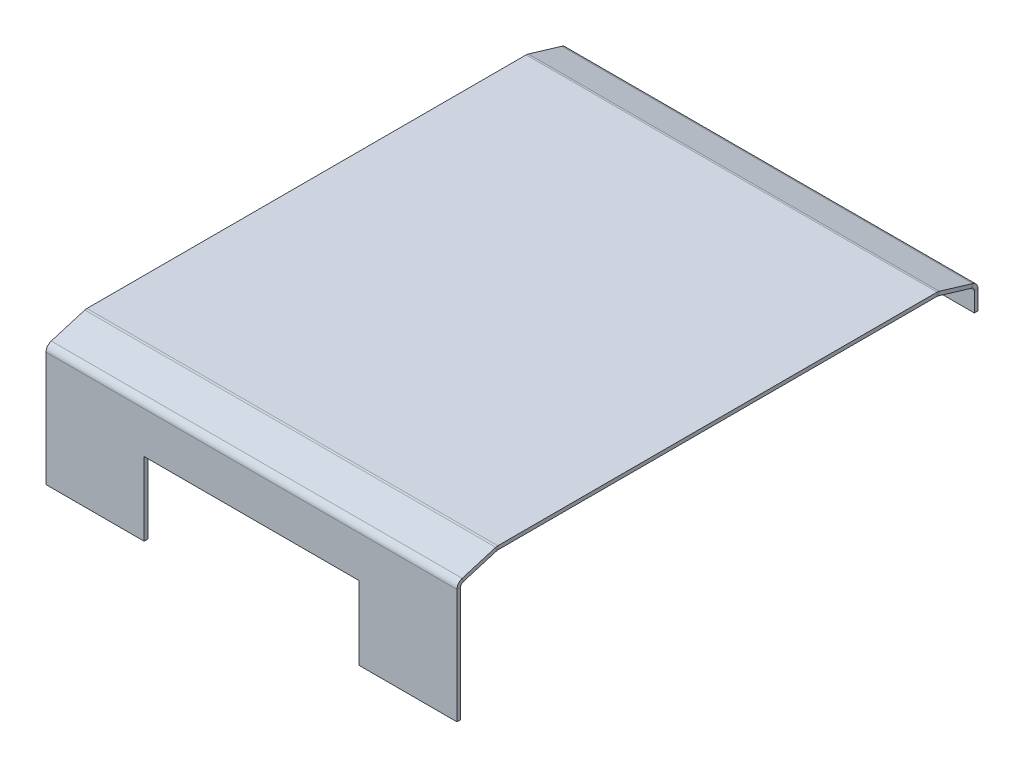
ISO-10303-21;
HEADER;
FILE_DESCRIPTION(('STEP AP214'),'2;1');
FILE_NAME('part.step','',(''),(''),'','','');
FILE_SCHEMA(('AUTOMOTIVE_DESIGN { 1 0 10303 214 1 1 1 1 }'));
ENDSEC;
DATA;
#1=APPLICATION_CONTEXT('core data for automotive mechanical design processes');
#2=APPLICATION_PROTOCOL_DEFINITION('international standard','automotive_design',2000,#1);
#3=PRODUCT_CONTEXT('',#1,'mechanical');
#4=PRODUCT('Part','Part','',(#3));
#5=PRODUCT_RELATED_PRODUCT_CATEGORY('part','',(#4));
#6=PRODUCT_DEFINITION_FORMATION('','',#4);
#7=PRODUCT_DEFINITION_CONTEXT('part definition',#1,'design');
#8=PRODUCT_DEFINITION('design','',#6,#7);
#9=PRODUCT_DEFINITION_SHAPE('','',#8);
#10=(LENGTH_UNIT() NAMED_UNIT(*) SI_UNIT(.MILLI.,.METRE.));
#11=(NAMED_UNIT(*) PLANE_ANGLE_UNIT() SI_UNIT($,.RADIAN.));
#12=(NAMED_UNIT(*) SI_UNIT($,.STERADIAN.) SOLID_ANGLE_UNIT());
#13=UNCERTAINTY_MEASURE_WITH_UNIT(LENGTH_MEASURE(1.E-05),#10,'distance_accuracy_value','');
#14=(GEOMETRIC_REPRESENTATION_CONTEXT(3) GLOBAL_UNCERTAINTY_ASSIGNED_CONTEXT((#13)) GLOBAL_UNIT_ASSIGNED_CONTEXT((#10,
#11,#12)) REPRESENTATION_CONTEXT('',''));
#15=CARTESIAN_POINT('',(0.,0.,0.));
#16=DIRECTION('',(0.,0.,1.));
#17=DIRECTION('',(1.,0.,0.));
#18=AXIS2_PLACEMENT_3D('',#15,#16,#17);
#19=CARTESIAN_POINT('',(762.461483089318,-144.999940000061,0.));
#20=DIRECTION('',(0.,-1.,0.));
#21=DIRECTION('',(0.,0.,-1.));
#22=AXIS2_PLACEMENT_3D('',#19,#20,#21);
#23=PLANE('',#22);
#24=DIRECTION('',(0.,0.,1.));
#25=VECTOR('',#24,1.);
#26=CARTESIAN_POINT('',(-396.222389534313,-144.999940000061,-705.));
#27=LINE('',#26,#25);
#28=CARTESIAN_POINT('',(-396.222389534313,-144.999940000061,0.));
#29=VERTEX_POINT('',#28);
#30=CARTESIAN_POINT('',(-396.222389534313,-144.999940000061,4.99999999999989));
#31=VERTEX_POINT('',#30);
#32=EDGE_CURVE('E208',#29,#31,#27,.T.);
#33=ORIENTED_EDGE('',*,*,#32,.T.);
#34=DIRECTION('',(-1.,0.,0.));
#35=VECTOR('',#34,1.);
#36=CARTESIAN_POINT('',(762.461483089318,-144.999940000061,4.99999999999989));
#37=LINE('',#36,#35);
#38=CARTESIAN_POINT('',(-529.999880000118,-144.999940000061,4.99999999999989));
#39=VERTEX_POINT('',#38);
#40=EDGE_CURVE('E220',#31,#39,#37,.T.);
#41=ORIENTED_EDGE('',*,*,#40,.T.);
#42=DIRECTION('',(0.,0.,1.));
#43=VECTOR('',#42,1.);
#44=CARTESIAN_POINT('',(-529.999880000118,-144.999940000061,4.99999999999989));
#45=LINE('',#44,#43);
#46=CARTESIAN_POINT('',(-529.999880000118,-144.999940000061,-1.06685493772574E-13));
#47=VERTEX_POINT('',#46);
#48=EDGE_CURVE('E336',#39,#47,#45,.F.);
#49=ORIENTED_EDGE('',*,*,#48,.T.);
#50=DIRECTION('',(-1.,0.,0.));
#51=VECTOR('',#50,1.);
#52=CARTESIAN_POINT('',(762.461483089318,-144.999940000061,0.));
#53=LINE('',#52,#51);
#54=EDGE_CURVE('E222',#29,#47,#53,.T.);
#55=ORIENTED_EDGE('',*,*,#54,.F.);
#56=EDGE_LOOP('',(#33,#41,#49,#55));
#57=FACE_BOUND('',#56,.T.);
#58=ADVANCED_FACE('F43',(#57),#23,.T.);
#59=CARTESIAN_POINT('',(762.461483089318,15.0000599999397,-700.));
#60=DIRECTION('',(0.,0.,-1.));
#61=DIRECTION('',(-1.,0.,0.));
#62=AXIS2_PLACEMENT_3D('',#59,#60,#61);
#63=PLANE('',#62);
#64=DIRECTION('',(0.,1.,0.));
#65=VECTOR('',#64,1.);
#66=CARTESIAN_POINT('',(29.9998800001182,15.0000599999397,-700.));
#67=LINE('',#66,#65);
#68=CARTESIAN_POINT('',(29.9998800001182,11.2799067454844,-700.));
#69=VERTEX_POINT('',#68);
#70=CARTESIAN_POINT('',(29.9998800001182,-14.9999400000603,-700.));
#71=VERTEX_POINT('',#70);
#72=EDGE_CURVE('E407',#69,#71,#67,.F.);
#73=ORIENTED_EDGE('',*,*,#72,.F.);
#74=DIRECTION('',(-1.,0.,0.));
#75=VECTOR('',#74,1.);
#76=CARTESIAN_POINT('',(762.461483089318,11.2799067454844,-700.));
#77=LINE('',#76,#75);
#78=CARTESIAN_POINT('',(-529.999880000118,11.2799067454844,-700.));
#79=VERTEX_POINT('',#78);
#80=EDGE_CURVE('E422',#69,#79,#77,.T.);
#81=ORIENTED_EDGE('',*,*,#80,.T.);
#82=DIRECTION('',(0.,-1.,0.));
#83=VECTOR('',#82,1.);
#84=CARTESIAN_POINT('',(-529.999880000118,15.0000599999397,-700.));
#85=LINE('',#84,#83);
#86=CARTESIAN_POINT('',(-529.999880000118,-14.9999400000603,-700.));
#87=VERTEX_POINT('',#86);
#88=EDGE_CURVE('E306',#79,#87,#85,.T.);
#89=ORIENTED_EDGE('',*,*,#88,.T.);
#90=DIRECTION('',(-1.,0.,0.));
#91=VECTOR('',#90,1.);
#92=CARTESIAN_POINT('',(762.461483089318,-14.9999400000603,-700.));
#93=LINE('',#92,#91);
#94=EDGE_CURVE('E256',#71,#87,#93,.T.);
#95=ORIENTED_EDGE('',*,*,#94,.F.);
#96=EDGE_LOOP('',(#73,#81,#89,#95));
#97=FACE_BOUND('',#96,.T.);
#98=ADVANCED_FACE('F45',(#97),#63,.F.);
#99=CARTESIAN_POINT('',(762.461483089318,-14.9999400000603,-705.));
#100=DIRECTION('',(0.,-1.,0.));
#101=DIRECTION('',(0.,0.,-1.));
#102=AXIS2_PLACEMENT_3D('',#99,#100,#101);
#103=PLANE('',#102);
#104=DIRECTION('',(-1.,0.,0.));
#105=VECTOR('',#104,1.);
#106=CARTESIAN_POINT('',(762.461483089318,-14.9999400000603,-705.));
#107=LINE('',#106,#105);
#108=CARTESIAN_POINT('',(29.9998800001182,-14.9999400000603,-705.));
#109=VERTEX_POINT('',#108);
#110=CARTESIAN_POINT('',(-529.999880000118,-14.9999400000603,-705.));
#111=VERTEX_POINT('',#110);
#112=EDGE_CURVE('E254',#109,#111,#107,.T.);
#113=ORIENTED_EDGE('',*,*,#112,.F.);
#114=DIRECTION('',(0.,0.,-1.));
#115=VECTOR('',#114,1.);
#116=CARTESIAN_POINT('',(29.9998800001182,-14.9999400000603,-705.));
#117=LINE('',#116,#115);
#118=EDGE_CURVE('E402',#109,#71,#117,.F.);
#119=ORIENTED_EDGE('',*,*,#118,.T.);
#120=ORIENTED_EDGE('',*,*,#94,.T.);
#121=DIRECTION('',(0.,0.,1.));
#122=VECTOR('',#121,1.);
#123=CARTESIAN_POINT('',(-529.999880000118,-14.9999400000603,-700.));
#124=LINE('',#123,#122);
#125=EDGE_CURVE('E347',#87,#111,#124,.F.);
#126=ORIENTED_EDGE('',*,*,#125,.T.);
#127=EDGE_LOOP('',(#113,#119,#120,#126));
#128=FACE_BOUND('',#127,.T.);
#129=ADVANCED_FACE('F534',(#128),#103,.T.);
#130=CARTESIAN_POINT('',(762.461483089318,15.0000599999397,-705.));
#131=DIRECTION('',(0.,0.,-1.));
#132=DIRECTION('',(-1.,0.,0.));
#133=AXIS2_PLACEMENT_3D('',#130,#131,#132);
#134=PLANE('',#133);
#135=DIRECTION('',(-1.,0.,0.));
#136=VECTOR('',#135,1.);
#137=CARTESIAN_POINT('',(762.461483089318,11.2799067454844,-705.));
#138=LINE('',#137,#136);
#139=CARTESIAN_POINT('',(29.9998800001182,11.2799067454844,-705.));
#140=VERTEX_POINT('',#139);
#141=CARTESIAN_POINT('',(-529.999880000118,11.2799067454844,-705.));
#142=VERTEX_POINT('',#141);
#143=EDGE_CURVE('E252',#140,#142,#138,.T.);
#144=ORIENTED_EDGE('',*,*,#143,.F.);
#145=DIRECTION('',(0.,-1.,0.));
#146=VECTOR('',#145,1.);
#147=CARTESIAN_POINT('',(29.9998800001182,15.0000599999397,-705.));
#148=LINE('',#147,#146);
#149=EDGE_CURVE('E359',#140,#109,#148,.T.);
#150=ORIENTED_EDGE('',*,*,#149,.T.);
#151=ORIENTED_EDGE('',*,*,#112,.T.);
#152=DIRECTION('',(0.,1.,0.));
#153=VECTOR('',#152,1.);
#154=CARTESIAN_POINT('',(-529.999880000118,15.0000599999397,-705.));
#155=LINE('',#154,#153);
#156=EDGE_CURVE('E341',#142,#111,#155,.F.);
#157=ORIENTED_EDGE('',*,*,#156,.F.);
#158=EDGE_LOOP('',(#144,#150,#151,#157));
#159=FACE_BOUND('',#158,.T.);
#160=ADVANCED_FACE('F538',(#159),#134,.T.);
#161=CARTESIAN_POINT('',(762.461483089318,11.2799067454844,-695.));
#162=DIRECTION('',(-1.,0.,0.));
#163=DIRECTION('',(0.,0.,1.));
#164=AXIS2_PLACEMENT_3D('',#161,#162,#163);
#165=CYLINDRICAL_SURFACE('',#164,10.);
#166=DIRECTION('',(-1.,0.,0.));
#167=VECTOR('',#166,1.);
#168=CARTESIAN_POINT('',(762.461483089318,20.8581695976959,-697.873478855663));
#169=LINE('',#168,#167);
#170=CARTESIAN_POINT('',(29.999880000118,20.8581695976959,-697.873478855663));
#171=VERTEX_POINT('',#170);
#172=CARTESIAN_POINT('',(-529.999880000118,20.8581695976959,-697.873478855663));
#173=VERTEX_POINT('',#172);
#174=EDGE_CURVE('E250',#171,#173,#169,.T.);
#175=ORIENTED_EDGE('',*,*,#174,.F.);
#176=CARTESIAN_POINT('',(29.9998800001182,11.2799067454844,-695.));
#177=DIRECTION('',(-1.,0.,0.));
#178=DIRECTION('',(0.,0.,1.));
#179=AXIS2_PLACEMENT_3D('',#176,#177,#178);
#180=CIRCLE('',#179,10.);
#181=EDGE_CURVE('E356',#140,#171,#180,.F.);
#182=ORIENTED_EDGE('',*,*,#181,.F.);
#183=ORIENTED_EDGE('',*,*,#143,.T.);
#184=CARTESIAN_POINT('',(-529.999880000118,11.2799067454844,-695.));
#185=DIRECTION('',(-1.,0.,0.));
#186=DIRECTION('',(0.,0.,1.));
#187=AXIS2_PLACEMENT_3D('',#184,#185,#186);
#188=CIRCLE('',#187,10.);
#189=EDGE_CURVE('E275',#173,#142,#188,.T.);
#190=ORIENTED_EDGE('',*,*,#189,.F.);
#191=EDGE_LOOP('',(#175,#182,#183,#190));
#192=FACE_BOUND('',#191,.T.);
#193=ADVANCED_FACE('F667',(#192),#165,.T.);
#194=CARTESIAN_POINT('',(762.461483089318,34.7891914260452,-651.436739427832));
#195=DIRECTION('',(0.,0.957826285221153,-0.287347885566341));
#196=DIRECTION('',(0.,0.287347885566341,0.957826285221153));
#197=AXIS2_PLACEMENT_3D('',#194,#195,#196);
#198=PLANE('',#197);
#199=DIRECTION('',(-1.,0.,0.));
#200=VECTOR('',#199,1.);
#201=CARTESIAN_POINT('',(762.461483089318,34.5783228521505,-652.139634674147));
#202=LINE('',#201,#200);
#203=CARTESIAN_POINT('',(29.9998800001182,34.5783228521508,-652.139634674147));
#204=VERTEX_POINT('',#203);
#205=CARTESIAN_POINT('',(-529.999880000118,34.5783228521505,-652.139634674147));
#206=VERTEX_POINT('',#205);
#207=EDGE_CURVE('E248',#204,#206,#202,.T.);
#208=ORIENTED_EDGE('',*,*,#207,.F.);
#209=DIRECTION('',(0.,0.287347885566341,0.957826285221153));
#210=VECTOR('',#209,1.);
#211=CARTESIAN_POINT('',(29.999880000118,34.7891914260452,-651.436739427832));
#212=LINE('',#211,#210);
#213=EDGE_CURVE('E415',#204,#171,#212,.F.);
#214=ORIENTED_EDGE('',*,*,#213,.T.);
#215=ORIENTED_EDGE('',*,*,#174,.T.);
#216=DIRECTION('',(0.,-0.287347885566341,-0.957826285221153));
#217=VECTOR('',#216,1.);
#218=CARTESIAN_POINT('',(-529.999880000118,34.7891914260452,-651.436739427832));
#219=LINE('',#218,#217);
#220=EDGE_CURVE('E299',#206,#173,#219,.T.);
#221=ORIENTED_EDGE('',*,*,#220,.F.);
#222=EDGE_LOOP('',(#208,#214,#215,#221));
#223=FACE_BOUND('',#222,.T.);
#224=ADVANCED_FACE('F507',(#223),#198,.T.);
#225=CARTESIAN_POINT('',(762.461483089318,25.0000599999393,-649.266155818484));
#226=DIRECTION('',(-1.,0.,0.));
#227=DIRECTION('',(0.,0.,1.));
#228=AXIS2_PLACEMENT_3D('',#225,#226,#227);
#229=CYLINDRICAL_SURFACE('',#228,10.);
#230=DIRECTION('',(-1.,0.,0.));
#231=VECTOR('',#230,1.);
#232=CARTESIAN_POINT('',(762.461483089318,35.0000599999393,-649.266155818484));
#233=LINE('',#232,#231);
#234=CARTESIAN_POINT('',(29.9998800001182,35.0000599999395,-649.266155818484));
#235=VERTEX_POINT('',#234);
#236=CARTESIAN_POINT('',(-529.999880000118,35.0000599999393,-649.266155818484));
#237=VERTEX_POINT('',#236);
#238=EDGE_CURVE('E246',#235,#237,#233,.T.);
#239=ORIENTED_EDGE('',*,*,#238,.F.);
#240=CARTESIAN_POINT('',(29.9998800001182,25.0000599999393,-649.266155818484));
#241=DIRECTION('',(-1.,0.,0.));
#242=DIRECTION('',(0.,0.,1.));
#243=AXIS2_PLACEMENT_3D('',#240,#241,#242);
#244=CIRCLE('',#243,10.);
#245=EDGE_CURVE('E357',#204,#235,#244,.F.);
#246=ORIENTED_EDGE('',*,*,#245,.F.);
#247=ORIENTED_EDGE('',*,*,#207,.T.);
#248=CARTESIAN_POINT('',(-529.999880000118,25.0000599999393,-649.266155818484));
#249=DIRECTION('',(-1.,0.,0.));
#250=DIRECTION('',(0.,0.,1.));
#251=AXIS2_PLACEMENT_3D('',#248,#249,#250);
#252=CIRCLE('',#251,10.);
#253=EDGE_CURVE('E282',#237,#206,#252,.T.);
#254=ORIENTED_EDGE('',*,*,#253,.F.);
#255=EDGE_LOOP('',(#239,#246,#247,#254));
#256=FACE_BOUND('',#255,.T.);
#257=ADVANCED_FACE('F498',(#256),#229,.T.);
#258=CARTESIAN_POINT('',(762.461483089318,35.0000599999395,-50.));
#259=DIRECTION('',(0.,1.,0.));
#260=DIRECTION('',(0.,0.,1.));
#261=AXIS2_PLACEMENT_3D('',#258,#259,#260);
#262=PLANE('',#261);
#263=DIRECTION('',(-1.,0.,0.));
#264=VECTOR('',#263,1.);
#265=CARTESIAN_POINT('',(762.461483089318,35.0000599999395,-50.7338441815175));
#266=LINE('',#265,#264);
#267=CARTESIAN_POINT('',(29.9998800001182,35.0000599999395,-50.7338441815175));
#268=VERTEX_POINT('',#267);
#269=CARTESIAN_POINT('',(-529.999880000118,35.0000599999395,-50.7338441815175));
#270=VERTEX_POINT('',#269);
#271=EDGE_CURVE('E244',#268,#270,#266,.T.);
#272=ORIENTED_EDGE('',*,*,#271,.F.);
#273=DIRECTION('',(0.,0.,1.));
#274=VECTOR('',#273,1.);
#275=CARTESIAN_POINT('',(29.9998800001182,35.0000599999395,-50.));
#276=LINE('',#275,#274);
#277=EDGE_CURVE('E370',#268,#235,#276,.F.);
#278=ORIENTED_EDGE('',*,*,#277,.T.);
#279=ORIENTED_EDGE('',*,*,#238,.T.);
#280=DIRECTION('',(0.,0.,-1.));
#281=VECTOR('',#280,1.);
#282=CARTESIAN_POINT('',(-529.999880000118,35.0000599999395,-50.));
#283=LINE('',#282,#281);
#284=EDGE_CURVE('E313',#270,#237,#283,.T.);
#285=ORIENTED_EDGE('',*,*,#284,.F.);
#286=EDGE_LOOP('',(#272,#278,#279,#285));
#287=FACE_BOUND('',#286,.T.);
#288=ADVANCED_FACE('F704',(#287),#262,.T.);
#289=CARTESIAN_POINT('',(762.461483089318,25.0000599999395,-50.7338441815175));
#290=DIRECTION('',(-1.,0.,0.));
#291=DIRECTION('',(0.,0.,1.));
#292=AXIS2_PLACEMENT_3D('',#289,#290,#291);
#293=CYLINDRICAL_SURFACE('',#292,10.);
#294=DIRECTION('',(-1.,0.,0.));
#295=VECTOR('',#294,1.);
#296=CARTESIAN_POINT('',(762.461483089318,34.578322852151,-47.8603653258542));
#297=LINE('',#296,#295);
#298=CARTESIAN_POINT('',(29.9998800001182,34.578322852151,-47.8603653258541));
#299=VERTEX_POINT('',#298);
#300=CARTESIAN_POINT('',(-529.999880000118,34.578322852151,-47.8603653258542));
#301=VERTEX_POINT('',#300);
#302=EDGE_CURVE('E242',#299,#301,#297,.T.);
#303=ORIENTED_EDGE('',*,*,#302,.F.);
#304=CARTESIAN_POINT('',(29.9998800001182,25.0000599999395,-50.7338441815175));
#305=DIRECTION('',(-1.,0.,0.));
#306=DIRECTION('',(0.,0.,1.));
#307=AXIS2_PLACEMENT_3D('',#304,#305,#306);
#308=CIRCLE('',#307,10.);
#309=EDGE_CURVE('E362',#268,#299,#308,.F.);
#310=ORIENTED_EDGE('',*,*,#309,.F.);
#311=ORIENTED_EDGE('',*,*,#271,.T.);
#312=CARTESIAN_POINT('',(-529.999880000118,25.0000599999395,-50.7338441815175));
#313=DIRECTION('',(-1.,0.,0.));
#314=DIRECTION('',(0.,0.,1.));
#315=AXIS2_PLACEMENT_3D('',#312,#313,#314);
#316=CIRCLE('',#315,10.);
#317=EDGE_CURVE('E288',#301,#270,#316,.T.);
#318=ORIENTED_EDGE('',*,*,#317,.F.);
#319=EDGE_LOOP('',(#303,#310,#311,#318));
#320=FACE_BOUND('',#319,.T.);
#321=ADVANCED_FACE('F729',(#320),#293,.T.);
#322=CARTESIAN_POINT('',(762.461483089318,19.7891914260452,1.43673942783162));
#323=DIRECTION('',(0.,0.957826285221151,0.287347885566345));
#324=DIRECTION('',(0.,-0.287347885566345,0.957826285221151));
#325=AXIS2_PLACEMENT_3D('',#322,#323,#324);
#326=PLANE('',#325);
#327=DIRECTION('',(-1.,0.,0.));
#328=VECTOR('',#327,1.);
#329=CARTESIAN_POINT('',(762.461483089318,20.8581695976957,-2.12652114433665));
#330=LINE('',#329,#328);
#331=CARTESIAN_POINT('',(29.9998800001182,20.8581695976958,-2.12652114433666));
#332=VERTEX_POINT('',#331);
#333=CARTESIAN_POINT('',(-529.999880000118,20.8581695976957,-2.12652114433665));
#334=VERTEX_POINT('',#333);
#335=EDGE_CURVE('E240',#332,#334,#330,.T.);
#336=ORIENTED_EDGE('',*,*,#335,.F.);
#337=DIRECTION('',(0.,-0.287347885566345,0.957826285221151));
#338=VECTOR('',#337,1.);
#339=CARTESIAN_POINT('',(29.9998800001182,19.7891914260452,1.43673942783173));
#340=LINE('',#339,#338);
#341=EDGE_CURVE('E383',#332,#299,#340,.F.);
#342=ORIENTED_EDGE('',*,*,#341,.T.);
#343=ORIENTED_EDGE('',*,*,#302,.T.);
#344=DIRECTION('',(0.,0.287347885566345,-0.957826285221151));
#345=VECTOR('',#344,1.);
#346=CARTESIAN_POINT('',(-529.999880000118,19.7891914260452,1.43673942783162));
#347=LINE('',#346,#345);
#348=EDGE_CURVE('E325',#334,#301,#347,.T.);
#349=ORIENTED_EDGE('',*,*,#348,.F.);
#350=EDGE_LOOP('',(#336,#342,#343,#349));
#351=FACE_BOUND('',#350,.T.);
#352=ADVANCED_FACE('F734',(#351),#326,.T.);
#353=CARTESIAN_POINT('',(762.461483089318,11.2799067454842,-4.99999999999989));
#354=DIRECTION('',(-1.,0.,0.));
#355=DIRECTION('',(0.,0.,1.));
#356=AXIS2_PLACEMENT_3D('',#353,#354,#355);
#357=CYLINDRICAL_SURFACE('',#356,10.);
#358=DIRECTION('',(-1.,0.,0.));
#359=VECTOR('',#358,1.);
#360=CARTESIAN_POINT('',(762.461483089318,11.2799067454842,5.00000000000012));
#361=LINE('',#360,#359);
#362=CARTESIAN_POINT('',(29.9998800001182,11.2799067454842,5.));
#363=VERTEX_POINT('',#362);
#364=CARTESIAN_POINT('',(-529.999880000118,11.2799067454842,5.00000000000011));
#365=VERTEX_POINT('',#364);
#366=EDGE_CURVE('E234',#363,#365,#361,.T.);
#367=ORIENTED_EDGE('',*,*,#366,.F.);
#368=CARTESIAN_POINT('',(29.9998800001182,11.2799067454842,-4.99999999999989));
#369=DIRECTION('',(-1.,0.,0.));
#370=DIRECTION('',(0.,0.,1.));
#371=AXIS2_PLACEMENT_3D('',#368,#369,#370);
#372=CIRCLE('',#371,10.);
#373=EDGE_CURVE('E366',#332,#363,#372,.F.);
#374=ORIENTED_EDGE('',*,*,#373,.F.);
#375=ORIENTED_EDGE('',*,*,#335,.T.);
#376=CARTESIAN_POINT('',(-529.999880000118,11.2799067454842,-4.99999999999989));
#377=DIRECTION('',(-1.,0.,0.));
#378=DIRECTION('',(0.,0.,1.));
#379=AXIS2_PLACEMENT_3D('',#376,#377,#378);
#380=CIRCLE('',#379,10.);
#381=EDGE_CURVE('E265',#365,#334,#380,.T.);
#382=ORIENTED_EDGE('',*,*,#381,.F.);
#383=EDGE_LOOP('',(#367,#374,#375,#382));
#384=FACE_BOUND('',#383,.T.);
#385=ADVANCED_FACE('F565',(#384),#357,.T.);
#386=CARTESIAN_POINT('',(762.461483089318,-14.9999400000606,4.99999999999989));
#387=DIRECTION('',(0.,0.,1.));
#388=DIRECTION('',(1.,0.,0.));
#389=AXIS2_PLACEMENT_3D('',#386,#387,#388);
#390=PLANE('',#389);
#391=DIRECTION('',(0.,-1.,0.));
#392=VECTOR('',#391,1.);
#393=CARTESIAN_POINT('',(-396.222389534313,-144.999940000061,4.99999999999989));
#394=LINE('',#393,#392);
#395=CARTESIAN_POINT('',(-396.222389534313,-44.9999400000605,4.99999999999989));
#396=VERTEX_POINT('',#395);
#397=EDGE_CURVE('E205',#396,#31,#394,.T.);
#398=ORIENTED_EDGE('',*,*,#397,.F.);
#399=DIRECTION('',(-1.,0.,0.));
#400=VECTOR('',#399,1.);
#401=CARTESIAN_POINT('',(-396.222389534313,-44.9999400000605,4.99999999999989));
#402=LINE('',#401,#400);
#403=CARTESIAN_POINT('',(-103.777610465686,-44.9999400000605,4.99999999999989));
#404=VERTEX_POINT('',#403);
#405=EDGE_CURVE('E224',#404,#396,#402,.T.);
#406=ORIENTED_EDGE('',*,*,#405,.F.);
#407=DIRECTION('',(0.,1.,0.));
#408=VECTOR('',#407,1.);
#409=CARTESIAN_POINT('',(-103.777610465686,-144.999940000061,4.99999999999989));
#410=LINE('',#409,#408);
#411=CARTESIAN_POINT('',(-103.777610465686,-144.999940000061,4.99999999999989));
#412=VERTEX_POINT('',#411);
#413=EDGE_CURVE('E215',#412,#404,#410,.T.);
#414=ORIENTED_EDGE('',*,*,#413,.F.);
#415=CARTESIAN_POINT('',(29.9998800001182,-144.999940000061,5.));
#416=VERTEX_POINT('',#415);
#417=EDGE_CURVE('E230',#416,#412,#37,.T.);
#418=ORIENTED_EDGE('',*,*,#417,.F.);
#419=DIRECTION('',(0.,1.,0.));
#420=VECTOR('',#419,1.);
#421=CARTESIAN_POINT('',(29.9998800001182,-14.9999400000606,5.));
#422=LINE('',#421,#420);
#423=EDGE_CURVE('E395',#416,#363,#422,.T.);
#424=ORIENTED_EDGE('',*,*,#423,.T.);
#425=ORIENTED_EDGE('',*,*,#366,.T.);
#426=DIRECTION('',(0.,1.,0.));
#427=VECTOR('',#426,1.);
#428=CARTESIAN_POINT('',(-529.999880000118,-14.9999400000606,4.99999999999989));
#429=LINE('',#428,#427);
#430=EDGE_CURVE('E229',#39,#365,#429,.T.);
#431=ORIENTED_EDGE('',*,*,#430,.F.);
#432=ORIENTED_EDGE('',*,*,#40,.F.);
#433=EDGE_LOOP('',(#398,#406,#414,#418,#424,#425,#431,#432));
#434=FACE_BOUND('',#433,.T.);
#435=ADVANCED_FACE('F227',(#434),#390,.T.);
#436=DIRECTION('',(0.,0.,1.));
#437=VECTOR('',#436,1.);
#438=CARTESIAN_POINT('',(-103.777610465686,-144.999940000061,-705.));
#439=LINE('',#438,#437);
#440=CARTESIAN_POINT('',(-103.777610465686,-144.999940000061,0.));
#441=VERTEX_POINT('',#440);
#442=EDGE_CURVE('E223',#441,#412,#439,.T.);
#443=ORIENTED_EDGE('',*,*,#442,.F.);
#444=CARTESIAN_POINT('',(29.9998800001182,-144.999940000061,0.));
#445=VERTEX_POINT('',#444);
#446=EDGE_CURVE('E231',#445,#441,#53,.T.);
#447=ORIENTED_EDGE('',*,*,#446,.F.);
#448=DIRECTION('',(0.,0.,-1.));
#449=VECTOR('',#448,1.);
#450=CARTESIAN_POINT('',(29.9998800001182,-144.999940000061,0.));
#451=LINE('',#450,#449);
#452=EDGE_CURVE('E398',#445,#416,#451,.F.);
#453=ORIENTED_EDGE('',*,*,#452,.T.);
#454=ORIENTED_EDGE('',*,*,#417,.T.);
#455=EDGE_LOOP('',(#443,#447,#453,#454));
#456=FACE_BOUND('',#455,.T.);
#457=ADVANCED_FACE('F552',(#456),#23,.T.);
#458=CARTESIAN_POINT('',(762.461483089318,-14.9999400000606,0.));
#459=DIRECTION('',(0.,0.,1.));
#460=DIRECTION('',(1.,0.,0.));
#461=AXIS2_PLACEMENT_3D('',#458,#459,#460);
#462=PLANE('',#461);
#463=DIRECTION('',(-1.,0.,0.));
#464=VECTOR('',#463,1.);
#465=CARTESIAN_POINT('',(762.461483089318,-44.9999400000605,0.));
#466=LINE('',#465,#464);
#467=CARTESIAN_POINT('',(-103.777610465686,-44.9999400000605,0.));
#468=VERTEX_POINT('',#467);
#469=CARTESIAN_POINT('',(-396.222389534313,-44.9999400000605,0.));
#470=VERTEX_POINT('',#469);
#471=EDGE_CURVE('E51',#468,#470,#466,.T.);
#472=ORIENTED_EDGE('',*,*,#471,.T.);
#473=DIRECTION('',(0.,-1.,0.));
#474=VECTOR('',#473,1.);
#475=CARTESIAN_POINT('',(-396.222389534313,-14.9999400000606,0.));
#476=LINE('',#475,#474);
#477=EDGE_CURVE('E11',#470,#29,#476,.T.);
#478=ORIENTED_EDGE('',*,*,#477,.T.);
#479=ORIENTED_EDGE('',*,*,#54,.T.);
#480=DIRECTION('',(0.,1.,0.));
#481=VECTOR('',#480,1.);
#482=CARTESIAN_POINT('',(-529.999880000118,-14.9999400000606,-1.06685493772574E-13));
#483=LINE('',#482,#481);
#484=CARTESIAN_POINT('',(-529.999880000118,11.2799067454842,-1.06685493772574E-13));
#485=VERTEX_POINT('',#484);
#486=EDGE_CURVE('E333',#47,#485,#483,.T.);
#487=ORIENTED_EDGE('',*,*,#486,.T.);
#488=DIRECTION('',(-1.,0.,0.));
#489=VECTOR('',#488,1.);
#490=CARTESIAN_POINT('',(762.461483089318,11.2799067454842,0.));
#491=LINE('',#490,#489);
#492=CARTESIAN_POINT('',(29.9998800001182,11.2799067454842,1.06685493772574E-13));
#493=VERTEX_POINT('',#492);
#494=EDGE_CURVE('E437',#493,#485,#491,.T.);
#495=ORIENTED_EDGE('',*,*,#494,.F.);
#496=DIRECTION('',(0.,1.,0.));
#497=VECTOR('',#496,1.);
#498=CARTESIAN_POINT('',(29.9998800001182,-14.9999400000606,0.));
#499=LINE('',#498,#497);
#500=EDGE_CURVE('E399',#445,#493,#499,.T.);
#501=ORIENTED_EDGE('',*,*,#500,.F.);
#502=ORIENTED_EDGE('',*,*,#446,.T.);
#503=DIRECTION('',(0.,1.,0.));
#504=VECTOR('',#503,1.);
#505=CARTESIAN_POINT('',(-103.777610465686,-14.9999400000606,0.));
#506=LINE('',#505,#504);
#507=EDGE_CURVE('E258',#441,#468,#506,.T.);
#508=ORIENTED_EDGE('',*,*,#507,.T.);
#509=EDGE_LOOP('',(#472,#478,#479,#487,#495,#501,#502,#508));
#510=FACE_BOUND('',#509,.T.);
#511=ADVANCED_FACE('F262',(#510),#462,.F.);
#512=CARTESIAN_POINT('',(762.461483089318,11.2799067454842,-4.99999999999989));
#513=DIRECTION('',(-1.,0.,0.));
#514=DIRECTION('',(0.,0.,1.));
#515=AXIS2_PLACEMENT_3D('',#512,#513,#514);
#516=CYLINDRICAL_SURFACE('',#515,5.);
#517=CARTESIAN_POINT('',(29.9998800001182,11.2799067454842,-4.99999999999989));
#518=DIRECTION('',(1.,0.,0.));
#519=DIRECTION('',(0.,0.,-1.));
#520=AXIS2_PLACEMENT_3D('',#517,#518,#519);
#521=CIRCLE('',#520,5.);
#522=CARTESIAN_POINT('',(29.9998800001182,16.06903817159,-3.56326057216827));
#523=VERTEX_POINT('',#522);
#524=EDGE_CURVE('E350',#493,#523,#521,.F.);
#525=ORIENTED_EDGE('',*,*,#524,.F.);
#526=ORIENTED_EDGE('',*,*,#494,.T.);
#527=CARTESIAN_POINT('',(-529.999880000118,11.2799067454842,-4.99999999999989));
#528=DIRECTION('',(1.,0.,0.));
#529=DIRECTION('',(0.,0.,-1.));
#530=AXIS2_PLACEMENT_3D('',#527,#528,#529);
#531=CIRCLE('',#530,5.);
#532=CARTESIAN_POINT('',(-529.999880000118,16.06903817159,-3.56326057216826));
#533=VERTEX_POINT('',#532);
#534=EDGE_CURVE('E268',#533,#485,#531,.T.);
#535=ORIENTED_EDGE('',*,*,#534,.F.);
#536=DIRECTION('',(-1.,0.,0.));
#537=VECTOR('',#536,1.);
#538=CARTESIAN_POINT('',(762.461483089318,16.06903817159,-3.56326057216827));
#539=LINE('',#538,#537);
#540=EDGE_CURVE('E436',#523,#533,#539,.T.);
#541=ORIENTED_EDGE('',*,*,#540,.F.);
#542=EDGE_LOOP('',(#525,#526,#535,#541));
#543=FACE_BOUND('',#542,.T.);
#544=ADVANCED_FACE('F451',(#543),#516,.F.);
#545=CARTESIAN_POINT('',(762.461483089318,15.0000599999395,0.));
#546=DIRECTION('',(0.,0.957826285221151,0.287347885566345));
#547=DIRECTION('',(0.,-0.287347885566345,0.957826285221151));
#548=AXIS2_PLACEMENT_3D('',#545,#546,#547);
#549=PLANE('',#548);
#550=DIRECTION('',(0.,0.287347885566345,-0.957826285221151));
#551=VECTOR('',#550,1.);
#552=CARTESIAN_POINT('',(29.9998800001182,15.0000599999395,0.));
#553=LINE('',#552,#551);
#554=CARTESIAN_POINT('',(29.9998800001182,29.7891914260453,-49.2971047536859));
#555=VERTEX_POINT('',#554);
#556=EDGE_CURVE('E387',#523,#555,#553,.T.);
#557=ORIENTED_EDGE('',*,*,#556,.F.);
#558=ORIENTED_EDGE('',*,*,#540,.T.);
#559=DIRECTION('',(0.,0.287347885566345,-0.957826285221151));
#560=VECTOR('',#559,1.);
#561=CARTESIAN_POINT('',(-529.999880000118,15.0000599999394,-1.03649727689614E-13));
#562=LINE('',#561,#560);
#563=CARTESIAN_POINT('',(-529.999880000118,29.7891914260452,-49.297104753686));
#564=VERTEX_POINT('',#563);
#565=EDGE_CURVE('E321',#533,#564,#562,.T.);
#566=ORIENTED_EDGE('',*,*,#565,.T.);
#567=DIRECTION('',(-1.,0.,0.));
#568=VECTOR('',#567,1.);
#569=CARTESIAN_POINT('',(762.461483089318,29.7891914260452,-49.2971047536859));
#570=LINE('',#569,#568);
#571=EDGE_CURVE('E434',#555,#564,#570,.T.);
#572=ORIENTED_EDGE('',*,*,#571,.F.);
#573=EDGE_LOOP('',(#557,#558,#566,#572));
#574=FACE_BOUND('',#573,.T.);
#575=ADVANCED_FACE('F455',(#574),#549,.F.);
#576=CARTESIAN_POINT('',(762.461483089318,25.0000599999395,-50.7338441815175));
#577=DIRECTION('',(-1.,0.,0.));
#578=DIRECTION('',(0.,0.,1.));
#579=AXIS2_PLACEMENT_3D('',#576,#577,#578);
#580=CYLINDRICAL_SURFACE('',#579,5.);
#581=CARTESIAN_POINT('',(29.9998800001182,25.0000599999395,-50.7338441815175));
#582=DIRECTION('',(1.,0.,0.));
#583=DIRECTION('',(0.,0.,-1.));
#584=AXIS2_PLACEMENT_3D('',#581,#582,#583);
#585=CIRCLE('',#584,5.);
#586=CARTESIAN_POINT('',(29.9998800001182,30.0000599999395,-50.7338441815175));
#587=VERTEX_POINT('',#586);
#588=EDGE_CURVE('E364',#555,#587,#585,.F.);
#589=ORIENTED_EDGE('',*,*,#588,.F.);
#590=ORIENTED_EDGE('',*,*,#571,.T.);
#591=CARTESIAN_POINT('',(-529.999880000118,25.0000599999395,-50.7338441815175));
#592=DIRECTION('',(1.,0.,0.));
#593=DIRECTION('',(0.,0.,-1.));
#594=AXIS2_PLACEMENT_3D('',#591,#592,#593);
#595=CIRCLE('',#594,5.);
#596=CARTESIAN_POINT('',(-529.999880000118,30.0000599999395,-50.7338441815175));
#597=VERTEX_POINT('',#596);
#598=EDGE_CURVE('E285',#597,#564,#595,.T.);
#599=ORIENTED_EDGE('',*,*,#598,.F.);
#600=DIRECTION('',(-1.,0.,0.));
#601=VECTOR('',#600,1.);
#602=CARTESIAN_POINT('',(762.461483089318,30.0000599999395,-50.7338441815175));
#603=LINE('',#602,#601);
#604=EDGE_CURVE('E432',#587,#597,#603,.T.);
#605=ORIENTED_EDGE('',*,*,#604,.F.);
#606=EDGE_LOOP('',(#589,#590,#599,#605));
#607=FACE_BOUND('',#606,.T.);
#608=ADVANCED_FACE('F469',(#607),#580,.F.);
#609=CARTESIAN_POINT('',(762.461483089318,30.0000599999395,-50.));
#610=DIRECTION('',(0.,1.,0.));
#611=DIRECTION('',(0.,0.,1.));
#612=AXIS2_PLACEMENT_3D('',#609,#610,#611);
#613=PLANE('',#612);
#614=DIRECTION('',(0.,0.,-1.));
#615=VECTOR('',#614,1.);
#616=CARTESIAN_POINT('',(29.9998800001182,30.0000599999395,-50.));
#617=LINE('',#616,#615);
#618=CARTESIAN_POINT('',(29.9998800001182,30.0000599999393,-649.266155818484));
#619=VERTEX_POINT('',#618);
#620=EDGE_CURVE('E374',#587,#619,#617,.T.);
#621=ORIENTED_EDGE('',*,*,#620,.F.);
#622=ORIENTED_EDGE('',*,*,#604,.T.);
#623=DIRECTION('',(0.,0.,-1.));
#624=VECTOR('',#623,1.);
#625=CARTESIAN_POINT('',(-529.999880000118,30.0000599999395,-50.));
#626=LINE('',#625,#624);
#627=CARTESIAN_POINT('',(-529.999880000118,30.0000599999395,-649.266155818484));
#628=VERTEX_POINT('',#627);
#629=EDGE_CURVE('E309',#597,#628,#626,.T.);
#630=ORIENTED_EDGE('',*,*,#629,.T.);
#631=DIRECTION('',(-1.,0.,0.));
#632=VECTOR('',#631,1.);
#633=CARTESIAN_POINT('',(762.461483089318,30.0000599999395,-649.266155818484));
#634=LINE('',#633,#632);
#635=EDGE_CURVE('E430',#619,#628,#634,.T.);
#636=ORIENTED_EDGE('',*,*,#635,.F.);
#637=EDGE_LOOP('',(#621,#622,#630,#636));
#638=FACE_BOUND('',#637,.T.);
#639=ADVANCED_FACE('F480',(#638),#613,.F.);
#640=CARTESIAN_POINT('',(762.461483089318,25.0000599999393,-649.266155818484));
#641=DIRECTION('',(-1.,0.,0.));
#642=DIRECTION('',(0.,0.,1.));
#643=AXIS2_PLACEMENT_3D('',#640,#641,#642);
#644=CYLINDRICAL_SURFACE('',#643,5.);
#645=CARTESIAN_POINT('',(29.9998800001182,25.0000599999393,-649.266155818484));
#646=DIRECTION('',(1.,0.,0.));
#647=DIRECTION('',(0.,0.,-1.));
#648=AXIS2_PLACEMENT_3D('',#645,#646,#647);
#649=CIRCLE('',#648,5.);
#650=CARTESIAN_POINT('',(29.9998800001182,29.7891914260447,-650.702895246316));
#651=VERTEX_POINT('',#650);
#652=EDGE_CURVE('E360',#619,#651,#649,.F.);
#653=ORIENTED_EDGE('',*,*,#652,.F.);
#654=ORIENTED_EDGE('',*,*,#635,.T.);
#655=CARTESIAN_POINT('',(-529.999880000118,25.0000599999393,-649.266155818484));
#656=DIRECTION('',(1.,0.,0.));
#657=DIRECTION('',(0.,0.,-1.));
#658=AXIS2_PLACEMENT_3D('',#655,#656,#657);
#659=CIRCLE('',#658,5.);
#660=CARTESIAN_POINT('',(-529.999880000118,29.789191426045,-650.702895246316));
#661=VERTEX_POINT('',#660);
#662=EDGE_CURVE('E279',#661,#628,#659,.T.);
#663=ORIENTED_EDGE('',*,*,#662,.F.);
#664=DIRECTION('',(-1.,0.,0.));
#665=VECTOR('',#664,1.);
#666=CARTESIAN_POINT('',(762.461483089318,29.7891914260447,-650.702895246316));
#667=LINE('',#666,#665);
#668=EDGE_CURVE('E428',#651,#661,#667,.T.);
#669=ORIENTED_EDGE('',*,*,#668,.F.);
#670=EDGE_LOOP('',(#653,#654,#663,#669));
#671=FACE_BOUND('',#670,.T.);
#672=ADVANCED_FACE('F484',(#671),#644,.F.);
#673=CARTESIAN_POINT('',(762.461483089318,30.0000599999395,-650.));
#674=DIRECTION('',(0.,0.957826285221153,-0.287347885566341));
#675=DIRECTION('',(0.,0.287347885566341,0.957826285221153));
#676=AXIS2_PLACEMENT_3D('',#673,#674,#675);
#677=PLANE('',#676);
#678=DIRECTION('',(0.,-0.287347885566341,-0.957826285221153));
#679=VECTOR('',#678,1.);
#680=CARTESIAN_POINT('',(29.9998800001182,30.0000599999395,-650.));
#681=LINE('',#680,#679);
#682=CARTESIAN_POINT('',(29.9998800001182,16.0690381715902,-696.436739427832));
#683=VERTEX_POINT('',#682);
#684=EDGE_CURVE('E66',#651,#683,#681,.T.);
#685=ORIENTED_EDGE('',*,*,#684,.F.);
#686=ORIENTED_EDGE('',*,*,#668,.T.);
#687=DIRECTION('',(0.,-0.287347885566341,-0.957826285221153));
#688=VECTOR('',#687,1.);
#689=CARTESIAN_POINT('',(-529.999880000118,30.0000599999394,-650.));
#690=LINE('',#689,#688);
#691=CARTESIAN_POINT('',(-529.999880000118,16.0690381715901,-696.436739427832));
#692=VERTEX_POINT('',#691);
#693=EDGE_CURVE('E295',#661,#692,#690,.T.);
#694=ORIENTED_EDGE('',*,*,#693,.T.);
#695=DIRECTION('',(-1.,0.,0.));
#696=VECTOR('',#695,1.);
#697=CARTESIAN_POINT('',(762.461483089318,16.0690381715902,-696.436739427832));
#698=LINE('',#697,#696);
#699=EDGE_CURVE('E426',#683,#692,#698,.T.);
#700=ORIENTED_EDGE('',*,*,#699,.F.);
#701=EDGE_LOOP('',(#685,#686,#694,#700));
#702=FACE_BOUND('',#701,.T.);
#703=ADVANCED_FACE('F519',(#702),#677,.F.);
#704=CARTESIAN_POINT('',(762.461483089318,11.2799067454844,-695.));
#705=DIRECTION('',(-1.,0.,0.));
#706=DIRECTION('',(0.,0.,1.));
#707=AXIS2_PLACEMENT_3D('',#704,#705,#706);
#708=CYLINDRICAL_SURFACE('',#707,5.);
#709=CARTESIAN_POINT('',(29.9998800001182,11.2799067454844,-695.));
#710=DIRECTION('',(1.,0.,0.));
#711=DIRECTION('',(0.,0.,-1.));
#712=AXIS2_PLACEMENT_3D('',#709,#710,#711);
#713=CIRCLE('',#712,5.);
#714=EDGE_CURVE('E353',#683,#69,#713,.F.);
#715=ORIENTED_EDGE('',*,*,#714,.F.);
#716=ORIENTED_EDGE('',*,*,#699,.T.);
#717=CARTESIAN_POINT('',(-529.999880000118,11.2799067454844,-695.));
#718=DIRECTION('',(1.,0.,0.));
#719=DIRECTION('',(0.,0.,-1.));
#720=AXIS2_PLACEMENT_3D('',#717,#718,#719);
#721=CIRCLE('',#720,5.);
#722=EDGE_CURVE('E278',#79,#692,#721,.T.);
#723=ORIENTED_EDGE('',*,*,#722,.F.);
#724=ORIENTED_EDGE('',*,*,#80,.F.);
#725=EDGE_LOOP('',(#715,#716,#723,#724));
#726=FACE_BOUND('',#725,.T.);
#727=ADVANCED_FACE('F522',(#726),#708,.F.);
#728=CARTESIAN_POINT('',(29.9998800001182,30.0000599999395,-650.));
#729=DIRECTION('',(1.,0.,0.));
#730=DIRECTION('',(0.,-0.287347885566341,-0.957826285221153));
#731=AXIS2_PLACEMENT_3D('',#728,#729,#730);
#732=PLANE('',#731);
#733=ORIENTED_EDGE('',*,*,#684,.T.);
#734=DIRECTION('',(0.,-0.957826285221153,0.287347885566341));
#735=VECTOR('',#734,1.);
#736=CARTESIAN_POINT('',(29.9998800001182,16.0690381715902,-696.436739427832));
#737=LINE('',#736,#735);
#738=EDGE_CURVE('E420',#683,#171,#737,.F.);
#739=ORIENTED_EDGE('',*,*,#738,.T.);
#740=ORIENTED_EDGE('',*,*,#213,.F.);
#741=DIRECTION('',(0.,-0.957826285221153,0.287347885566341));
#742=VECTOR('',#741,1.);
#743=CARTESIAN_POINT('',(29.9998800001182,29.7891914260447,-650.702895246316));
#744=LINE('',#743,#742);
#745=EDGE_CURVE('E418',#651,#204,#744,.F.);
#746=ORIENTED_EDGE('',*,*,#745,.F.);
#747=EDGE_LOOP('',(#733,#739,#740,#746));
#748=FACE_BOUND('',#747,.T.);
#749=ADVANCED_FACE('F681',(#748),#732,.T.);
#750=CARTESIAN_POINT('',(29.9998800001182,-14.9999400000606,0.));
#751=DIRECTION('',(1.,0.,0.));
#752=DIRECTION('',(0.,1.,0.));
#753=AXIS2_PLACEMENT_3D('',#750,#751,#752);
#754=PLANE('',#753);
#755=ORIENTED_EDGE('',*,*,#500,.T.);
#756=DIRECTION('',(0.,0.,-1.));
#757=VECTOR('',#756,1.);
#758=CARTESIAN_POINT('',(29.9998800001182,11.2799067454842,0.));
#759=LINE('',#758,#757);
#760=EDGE_CURVE('E390',#493,#363,#759,.F.);
#761=ORIENTED_EDGE('',*,*,#760,.T.);
#762=ORIENTED_EDGE('',*,*,#423,.F.);
#763=ORIENTED_EDGE('',*,*,#452,.F.);
#764=EDGE_LOOP('',(#755,#761,#762,#763));
#765=FACE_BOUND('',#764,.T.);
#766=ADVANCED_FACE('F572',(#765),#754,.T.);
#767=CARTESIAN_POINT('',(29.9998800001182,11.2799067454842,-4.99999999999989));
#768=DIRECTION('',(-1.,0.,0.));
#769=DIRECTION('',(0.,0.,1.));
#770=AXIS2_PLACEMENT_3D('',#767,#768,#769);
#771=PLANE('',#770);
#772=ORIENTED_EDGE('',*,*,#373,.T.);
#773=ORIENTED_EDGE('',*,*,#760,.F.);
#774=ORIENTED_EDGE('',*,*,#524,.T.);
#775=DIRECTION('',(0.,-0.957826285221151,-0.287347885566345));
#776=VECTOR('',#775,1.);
#777=CARTESIAN_POINT('',(29.9998800001182,16.06903817159,-3.56326057216827));
#778=LINE('',#777,#776);
#779=EDGE_CURVE('E386',#523,#332,#778,.F.);
#780=ORIENTED_EDGE('',*,*,#779,.T.);
#781=EDGE_LOOP('',(#772,#773,#774,#780));
#782=FACE_BOUND('',#781,.T.);
#783=ADVANCED_FACE('F753',(#782),#771,.F.);
#784=CARTESIAN_POINT('',(29.9998800001182,15.0000599999395,0.));
#785=DIRECTION('',(1.,0.,0.));
#786=DIRECTION('',(0.,0.287347885566345,-0.957826285221151));
#787=AXIS2_PLACEMENT_3D('',#784,#785,#786);
#788=PLANE('',#787);
#789=ORIENTED_EDGE('',*,*,#556,.T.);
#790=DIRECTION('',(0.,-0.957826285221151,-0.287347885566345));
#791=VECTOR('',#790,1.);
#792=CARTESIAN_POINT('',(29.9998800001182,29.7891914260452,-49.2971047536859));
#793=LINE('',#792,#791);
#794=EDGE_CURVE('E377',#555,#299,#793,.F.);
#795=ORIENTED_EDGE('',*,*,#794,.T.);
#796=ORIENTED_EDGE('',*,*,#341,.F.);
#797=ORIENTED_EDGE('',*,*,#779,.F.);
#798=EDGE_LOOP('',(#789,#795,#796,#797));
#799=FACE_BOUND('',#798,.T.);
#800=ADVANCED_FACE('F724',(#799),#788,.T.);
#801=CARTESIAN_POINT('',(29.9998800001182,25.0000599999395,-50.7338441815175));
#802=DIRECTION('',(-1.,0.,0.));
#803=DIRECTION('',(0.,0.,1.));
#804=AXIS2_PLACEMENT_3D('',#801,#802,#803);
#805=PLANE('',#804);
#806=ORIENTED_EDGE('',*,*,#309,.T.);
#807=ORIENTED_EDGE('',*,*,#794,.F.);
#808=ORIENTED_EDGE('',*,*,#588,.T.);
#809=DIRECTION('',(0.,-1.,0.));
#810=VECTOR('',#809,1.);
#811=CARTESIAN_POINT('',(29.9998800001182,30.0000599999395,-50.7338441815175));
#812=LINE('',#811,#810);
#813=EDGE_CURVE('E373',#587,#268,#812,.F.);
#814=ORIENTED_EDGE('',*,*,#813,.T.);
#815=EDGE_LOOP('',(#806,#807,#808,#814));
#816=FACE_BOUND('',#815,.T.);
#817=ADVANCED_FACE('F472',(#816),#805,.F.);
#818=CARTESIAN_POINT('',(29.9998800001182,30.0000599999395,-50.));
#819=DIRECTION('',(1.,0.,0.));
#820=DIRECTION('',(0.,0.,-1.));
#821=AXIS2_PLACEMENT_3D('',#818,#819,#820);
#822=PLANE('',#821);
#823=ORIENTED_EDGE('',*,*,#620,.T.);
#824=DIRECTION('',(0.,-1.,0.));
#825=VECTOR('',#824,1.);
#826=CARTESIAN_POINT('',(29.9998800001182,30.0000599999395,-649.266155818484));
#827=LINE('',#826,#825);
#828=EDGE_CURVE('E378',#619,#235,#827,.F.);
#829=ORIENTED_EDGE('',*,*,#828,.T.);
#830=ORIENTED_EDGE('',*,*,#277,.F.);
#831=ORIENTED_EDGE('',*,*,#813,.F.);
#832=EDGE_LOOP('',(#823,#829,#830,#831));
#833=FACE_BOUND('',#832,.T.);
#834=ADVANCED_FACE('F476',(#833),#822,.T.);
#835=CARTESIAN_POINT('',(29.9998800001182,25.0000599999393,-649.266155818484));
#836=DIRECTION('',(-1.,0.,0.));
#837=DIRECTION('',(0.,0.,1.));
#838=AXIS2_PLACEMENT_3D('',#835,#836,#837);
#839=PLANE('',#838);
#840=ORIENTED_EDGE('',*,*,#245,.T.);
#841=ORIENTED_EDGE('',*,*,#828,.F.);
#842=ORIENTED_EDGE('',*,*,#652,.T.);
#843=ORIENTED_EDGE('',*,*,#745,.T.);
#844=EDGE_LOOP('',(#840,#841,#842,#843));
#845=FACE_BOUND('',#844,.T.);
#846=ADVANCED_FACE('F690',(#845),#839,.F.);
#847=CARTESIAN_POINT('',(29.9998800001182,15.0000599999397,-705.));
#848=DIRECTION('',(1.,0.,0.));
#849=DIRECTION('',(0.,-1.,0.));
#850=AXIS2_PLACEMENT_3D('',#847,#848,#849);
#851=PLANE('',#850);
#852=ORIENTED_EDGE('',*,*,#118,.F.);
#853=ORIENTED_EDGE('',*,*,#149,.F.);
#854=DIRECTION('',(0.,0.,-1.));
#855=VECTOR('',#854,1.);
#856=CARTESIAN_POINT('',(29.9998800001182,11.2799067454844,-705.));
#857=LINE('',#856,#855);
#858=EDGE_CURVE('E409',#140,#69,#857,.F.);
#859=ORIENTED_EDGE('',*,*,#858,.T.);
#860=ORIENTED_EDGE('',*,*,#72,.T.);
#861=EDGE_LOOP('',(#852,#853,#859,#860));
#862=FACE_BOUND('',#861,.T.);
#863=ADVANCED_FACE('F531',(#862),#851,.T.);
#864=CARTESIAN_POINT('',(29.9998800001182,11.2799067454844,-695.));
#865=DIRECTION('',(-1.,0.,0.));
#866=DIRECTION('',(0.,0.,1.));
#867=AXIS2_PLACEMENT_3D('',#864,#865,#866);
#868=PLANE('',#867);
#869=ORIENTED_EDGE('',*,*,#181,.T.);
#870=ORIENTED_EDGE('',*,*,#738,.F.);
#871=ORIENTED_EDGE('',*,*,#714,.T.);
#872=ORIENTED_EDGE('',*,*,#858,.F.);
#873=EDGE_LOOP('',(#869,#870,#871,#872));
#874=FACE_BOUND('',#873,.T.);
#875=ADVANCED_FACE('F526',(#874),#868,.F.);
#876=CARTESIAN_POINT('',(-529.999880000118,15.0000599999397,-700.));
#877=DIRECTION('',(-1.,0.,0.));
#878=DIRECTION('',(0.,-1.,0.));
#879=AXIS2_PLACEMENT_3D('',#876,#877,#878);
#880=PLANE('',#879);
#881=ORIENTED_EDGE('',*,*,#125,.F.);
#882=ORIENTED_EDGE('',*,*,#88,.F.);
#883=DIRECTION('',(0.,0.,1.));
#884=VECTOR('',#883,1.);
#885=CARTESIAN_POINT('',(-529.999880000118,11.2799067454844,-700.));
#886=LINE('',#885,#884);
#887=EDGE_CURVE('E344',#79,#142,#886,.F.);
#888=ORIENTED_EDGE('',*,*,#887,.T.);
#889=ORIENTED_EDGE('',*,*,#156,.T.);
#890=EDGE_LOOP('',(#881,#882,#888,#889));
#891=FACE_BOUND('',#890,.T.);
#892=ADVANCED_FACE('F540',(#891),#880,.T.);
#893=CARTESIAN_POINT('',(-529.999880000118,-14.9999400000606,4.99999999999989));
#894=DIRECTION('',(-1.,0.,0.));
#895=DIRECTION('',(0.,1.,0.));
#896=AXIS2_PLACEMENT_3D('',#893,#894,#895);
#897=PLANE('',#896);
#898=ORIENTED_EDGE('',*,*,#430,.T.);
#899=DIRECTION('',(0.,0.,1.));
#900=VECTOR('',#899,1.);
#901=CARTESIAN_POINT('',(-529.999880000118,11.2799067454842,5.00000000000012));
#902=LINE('',#901,#900);
#903=EDGE_CURVE('E328',#365,#485,#902,.F.);
#904=ORIENTED_EDGE('',*,*,#903,.T.);
#905=ORIENTED_EDGE('',*,*,#486,.F.);
#906=ORIENTED_EDGE('',*,*,#48,.F.);
#907=EDGE_LOOP('',(#898,#904,#905,#906));
#908=FACE_BOUND('',#907,.T.);
#909=ADVANCED_FACE('F444',(#908),#897,.T.);
#910=CARTESIAN_POINT('',(-529.999880000118,11.2799067454842,-4.99999999999989));
#911=DIRECTION('',(1.,0.,0.));
#912=DIRECTION('',(0.,0.,-1.));
#913=AXIS2_PLACEMENT_3D('',#910,#911,#912);
#914=PLANE('',#913);
#915=ORIENTED_EDGE('',*,*,#534,.T.);
#916=ORIENTED_EDGE('',*,*,#903,.F.);
#917=ORIENTED_EDGE('',*,*,#381,.T.);
#918=DIRECTION('',(0.,0.957826285221151,0.287347885566345));
#919=VECTOR('',#918,1.);
#920=CARTESIAN_POINT('',(-529.999880000118,20.8581695976957,-2.12652114433665));
#921=LINE('',#920,#919);
#922=EDGE_CURVE('E324',#334,#533,#921,.F.);
#923=ORIENTED_EDGE('',*,*,#922,.T.);
#924=EDGE_LOOP('',(#915,#916,#917,#923));
#925=FACE_BOUND('',#924,.T.);
#926=ADVANCED_FACE('F448',(#925),#914,.F.);
#927=CARTESIAN_POINT('',(-529.999880000118,19.7891914260452,1.43673942783162));
#928=DIRECTION('',(-1.,0.,0.));
#929=DIRECTION('',(0.,0.287347885566345,-0.957826285221151));
#930=AXIS2_PLACEMENT_3D('',#927,#928,#929);
#931=PLANE('',#930);
#932=ORIENTED_EDGE('',*,*,#348,.T.);
#933=DIRECTION('',(0.,0.957826285221151,0.287347885566345));
#934=VECTOR('',#933,1.);
#935=CARTESIAN_POINT('',(-529.999880000118,34.578322852151,-47.8603653258542));
#936=LINE('',#935,#934);
#937=EDGE_CURVE('E316',#301,#564,#936,.F.);
#938=ORIENTED_EDGE('',*,*,#937,.T.);
#939=ORIENTED_EDGE('',*,*,#565,.F.);
#940=ORIENTED_EDGE('',*,*,#922,.F.);
#941=EDGE_LOOP('',(#932,#938,#939,#940));
#942=FACE_BOUND('',#941,.T.);
#943=ADVANCED_FACE('F458',(#942),#931,.T.);
#944=CARTESIAN_POINT('',(-529.999880000118,25.0000599999395,-50.7338441815175));
#945=DIRECTION('',(1.,0.,0.));
#946=DIRECTION('',(0.,0.,-1.));
#947=AXIS2_PLACEMENT_3D('',#944,#945,#946);
#948=PLANE('',#947);
#949=ORIENTED_EDGE('',*,*,#598,.T.);
#950=ORIENTED_EDGE('',*,*,#937,.F.);
#951=ORIENTED_EDGE('',*,*,#317,.T.);
#952=DIRECTION('',(0.,1.,0.));
#953=VECTOR('',#952,1.);
#954=CARTESIAN_POINT('',(-529.999880000118,35.0000599999395,-50.7338441815175));
#955=LINE('',#954,#953);
#956=EDGE_CURVE('E312',#270,#597,#955,.F.);
#957=ORIENTED_EDGE('',*,*,#956,.T.);
#958=EDGE_LOOP('',(#949,#950,#951,#957));
#959=FACE_BOUND('',#958,.T.);
#960=ADVANCED_FACE('F463',(#959),#948,.F.);
#961=CARTESIAN_POINT('',(-529.999880000118,35.0000599999395,-50.));
#962=DIRECTION('',(-1.,0.,0.));
#963=DIRECTION('',(0.,0.,-1.));
#964=AXIS2_PLACEMENT_3D('',#961,#962,#963);
#965=PLANE('',#964);
#966=ORIENTED_EDGE('',*,*,#284,.T.);
#967=DIRECTION('',(0.,1.,0.));
#968=VECTOR('',#967,1.);
#969=CARTESIAN_POINT('',(-529.999880000118,35.0000599999393,-649.266155818484));
#970=LINE('',#969,#968);
#971=EDGE_CURVE('E302',#237,#628,#970,.F.);
#972=ORIENTED_EDGE('',*,*,#971,.T.);
#973=ORIENTED_EDGE('',*,*,#629,.F.);
#974=ORIENTED_EDGE('',*,*,#956,.F.);
#975=EDGE_LOOP('',(#966,#972,#973,#974));
#976=FACE_BOUND('',#975,.T.);
#977=ADVANCED_FACE('F491',(#976),#965,.T.);
#978=CARTESIAN_POINT('',(-529.999880000118,25.0000599999393,-649.266155818484));
#979=DIRECTION('',(1.,0.,0.));
#980=DIRECTION('',(0.,0.,-1.));
#981=AXIS2_PLACEMENT_3D('',#978,#979,#980);
#982=PLANE('',#981);
#983=ORIENTED_EDGE('',*,*,#662,.T.);
#984=ORIENTED_EDGE('',*,*,#971,.F.);
#985=ORIENTED_EDGE('',*,*,#253,.T.);
#986=DIRECTION('',(0.,0.957826285221153,-0.287347885566341));
#987=VECTOR('',#986,1.);
#988=CARTESIAN_POINT('',(-529.999880000118,34.5783228521505,-652.139634674147));
#989=LINE('',#988,#987);
#990=EDGE_CURVE('E298',#206,#661,#989,.F.);
#991=ORIENTED_EDGE('',*,*,#990,.T.);
#992=EDGE_LOOP('',(#983,#984,#985,#991));
#993=FACE_BOUND('',#992,.T.);
#994=ADVANCED_FACE('F488',(#993),#982,.F.);
#995=CARTESIAN_POINT('',(-529.999880000118,34.7891914260452,-651.436739427832));
#996=DIRECTION('',(-1.,0.,0.));
#997=DIRECTION('',(0.,-0.287347885566341,-0.957826285221153));
#998=AXIS2_PLACEMENT_3D('',#995,#996,#997);
#999=PLANE('',#998);
#1000=ORIENTED_EDGE('',*,*,#220,.T.);
#1001=DIRECTION('',(0.,0.957826285221153,-0.287347885566341));
#1002=VECTOR('',#1001,1.);
#1003=CARTESIAN_POINT('',(-529.999880000118,20.8581695976959,-697.873478855663));
#1004=LINE('',#1003,#1002);
#1005=EDGE_CURVE('E303',#173,#692,#1004,.F.);
#1006=ORIENTED_EDGE('',*,*,#1005,.T.);
#1007=ORIENTED_EDGE('',*,*,#693,.F.);
#1008=ORIENTED_EDGE('',*,*,#990,.F.);
#1009=EDGE_LOOP('',(#1000,#1006,#1007,#1008));
#1010=FACE_BOUND('',#1009,.T.);
#1011=ADVANCED_FACE('F504',(#1010),#999,.T.);
#1012=CARTESIAN_POINT('',(-529.999880000118,11.2799067454844,-695.));
#1013=DIRECTION('',(1.,0.,0.));
#1014=DIRECTION('',(0.,0.,-1.));
#1015=AXIS2_PLACEMENT_3D('',#1012,#1013,#1014);
#1016=PLANE('',#1015);
#1017=ORIENTED_EDGE('',*,*,#722,.T.);
#1018=ORIENTED_EDGE('',*,*,#1005,.F.);
#1019=ORIENTED_EDGE('',*,*,#189,.T.);
#1020=ORIENTED_EDGE('',*,*,#887,.F.);
#1021=EDGE_LOOP('',(#1017,#1018,#1019,#1020));
#1022=FACE_BOUND('',#1021,.T.);
#1023=ADVANCED_FACE('F513',(#1022),#1016,.F.);
#1024=CARTESIAN_POINT('',(-396.222389534313,-144.999940000061,-705.));
#1025=DIRECTION('',(-1.,0.,0.));
#1026=DIRECTION('',(0.,0.,1.));
#1027=AXIS2_PLACEMENT_3D('',#1024,#1025,#1026);
#1028=PLANE('',#1027);
#1029=DIRECTION('',(0.,0.,1.));
#1030=VECTOR('',#1029,1.);
#1031=CARTESIAN_POINT('',(-396.222389534313,-44.9999400000605,-705.));
#1032=LINE('',#1031,#1030);
#1033=EDGE_CURVE('E210',#470,#396,#1032,.T.);
#1034=ORIENTED_EDGE('',*,*,#1033,.T.);
#1035=ORIENTED_EDGE('',*,*,#397,.T.);
#1036=ORIENTED_EDGE('',*,*,#32,.F.);
#1037=ORIENTED_EDGE('',*,*,#477,.F.);
#1038=EDGE_LOOP('',(#1034,#1035,#1036,#1037));
#1039=FACE_BOUND('',#1038,.T.);
#1040=ADVANCED_FACE('F207',(#1039),#1028,.F.);
#1041=CARTESIAN_POINT('',(-396.222389534313,-44.9999400000605,-705.));
#1042=DIRECTION('',(0.,1.,0.));
#1043=DIRECTION('',(0.,0.,1.));
#1044=AXIS2_PLACEMENT_3D('',#1041,#1042,#1043);
#1045=PLANE('',#1044);
#1046=DIRECTION('',(0.,0.,1.));
#1047=VECTOR('',#1046,1.);
#1048=CARTESIAN_POINT('',(-103.777610465686,-44.9999400000605,-705.));
#1049=LINE('',#1048,#1047);
#1050=EDGE_CURVE('E58',#468,#404,#1049,.T.);
#1051=ORIENTED_EDGE('',*,*,#1050,.T.);
#1052=ORIENTED_EDGE('',*,*,#405,.T.);
#1053=ORIENTED_EDGE('',*,*,#1033,.F.);
#1054=ORIENTED_EDGE('',*,*,#471,.F.);
#1055=EDGE_LOOP('',(#1051,#1052,#1053,#1054));
#1056=FACE_BOUND('',#1055,.T.);
#1057=ADVANCED_FACE('F264',(#1056),#1045,.F.);
#1058=CARTESIAN_POINT('',(-103.777610465686,-144.999940000061,-705.));
#1059=DIRECTION('',(1.,0.,0.));
#1060=DIRECTION('',(0.,0.,-1.));
#1061=AXIS2_PLACEMENT_3D('',#1058,#1059,#1060);
#1062=PLANE('',#1061);
#1063=ORIENTED_EDGE('',*,*,#442,.T.);
#1064=ORIENTED_EDGE('',*,*,#413,.T.);
#1065=ORIENTED_EDGE('',*,*,#1050,.F.);
#1066=ORIENTED_EDGE('',*,*,#507,.F.);
#1067=EDGE_LOOP('',(#1063,#1064,#1065,#1066));
#1068=FACE_BOUND('',#1067,.T.);
#1069=ADVANCED_FACE('F574',(#1068),#1062,.F.);
#1070=CLOSED_SHELL('',(#58,#98,#129,#160,#193,#224,#257,#288,#321,#352,#385,#435,#457,#511,#544,
#575,#608,#639,#672,#703,#727,#749,#766,#783,#800,#817,#834,#846,#863,#875,#892,#909,#926,#943,
#960,#977,#994,#1011,#1023,#1040,#1057,#1069));
#1071=MANIFOLD_SOLID_BREP('B2',#1070);
#1072=ADVANCED_BREP_SHAPE_REPRESENTATION('',(#18,#1071),#14);
#1073=SHAPE_DEFINITION_REPRESENTATION(#9,#1072);
ENDSEC;
END-ISO-10303-21;
